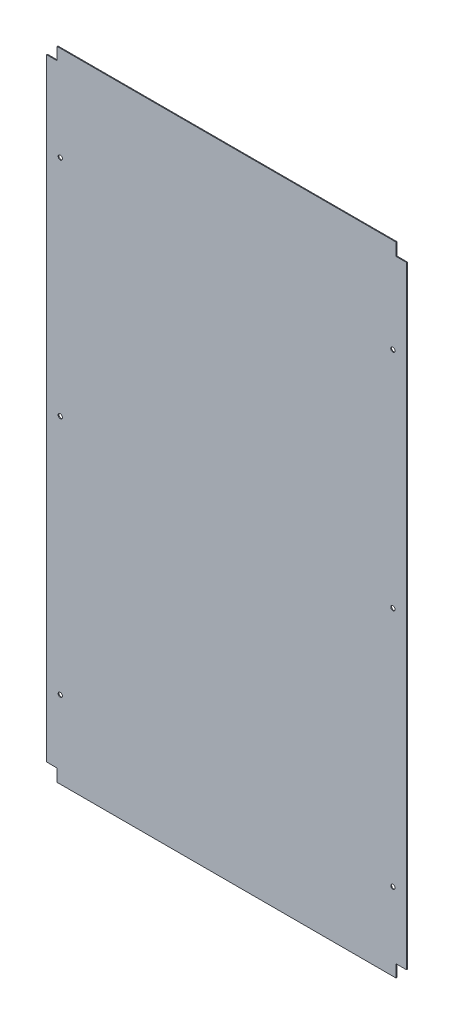
ISO-10303-21;
HEADER;
FILE_DESCRIPTION(('STEP AP214'),'2;1');
FILE_NAME('part.step','',(''),(''),'','','');
FILE_SCHEMA(('AUTOMOTIVE_DESIGN { 1 0 10303 214 1 1 1 1 }'));
ENDSEC;
DATA;
#1=APPLICATION_CONTEXT('core data for automotive mechanical design processes');
#2=APPLICATION_PROTOCOL_DEFINITION('international standard','automotive_design',2000,#1);
#3=PRODUCT_CONTEXT('',#1,'mechanical');
#4=PRODUCT('Part','Part','',(#3));
#5=PRODUCT_RELATED_PRODUCT_CATEGORY('part','',(#4));
#6=PRODUCT_DEFINITION_FORMATION('','',#4);
#7=PRODUCT_DEFINITION_CONTEXT('part definition',#1,'design');
#8=PRODUCT_DEFINITION('design','',#6,#7);
#9=PRODUCT_DEFINITION_SHAPE('','',#8);
#10=(LENGTH_UNIT() NAMED_UNIT(*) SI_UNIT(.MILLI.,.METRE.));
#11=(NAMED_UNIT(*) PLANE_ANGLE_UNIT() SI_UNIT($,.RADIAN.));
#12=(NAMED_UNIT(*) SI_UNIT($,.STERADIAN.) SOLID_ANGLE_UNIT());
#13=UNCERTAINTY_MEASURE_WITH_UNIT(LENGTH_MEASURE(1.E-05),#10,'distance_accuracy_value','');
#14=(GEOMETRIC_REPRESENTATION_CONTEXT(3) GLOBAL_UNCERTAINTY_ASSIGNED_CONTEXT((#13)) GLOBAL_UNIT_ASSIGNED_CONTEXT((#10,
#11,#12)) REPRESENTATION_CONTEXT('',''));
#15=CARTESIAN_POINT('',(0.,0.,0.));
#16=DIRECTION('',(0.,0.,1.));
#17=DIRECTION('',(1.,0.,0.));
#18=AXIS2_PLACEMENT_3D('',#15,#16,#17);
#19=CARTESIAN_POINT('',(0.,0.,-1.524));
#20=DIRECTION('',(0.,0.,1.));
#21=DIRECTION('',(1.,0.,0.));
#22=AXIS2_PLACEMENT_3D('',#19,#20,#21);
#23=PLANE('',#22);
#24=CARTESIAN_POINT('',(-306.451,-1.11022302462516E-13,-1.524));
#25=DIRECTION('',(0.,0.,1.));
#26=DIRECTION('',(1.,0.,0.));
#27=AXIS2_PLACEMENT_3D('',#24,#25,#26);
#28=CIRCLE('',#27,3.9624);
#29=CARTESIAN_POINT('',(-302.4886,-1.11022302462516E-13,-1.524));
#30=VERTEX_POINT('',#29);
#31=EDGE_CURVE('E420',#30,#30,#28,.T.);
#32=ORIENTED_EDGE('',*,*,#31,.T.);
#33=EDGE_LOOP('',(#32));
#34=FACE_BOUND('',#33,.T.);
#35=CARTESIAN_POINT('',(-306.451,412.75,-1.524));
#36=DIRECTION('',(0.,0.,1.));
#37=DIRECTION('',(1.,0.,0.));
#38=AXIS2_PLACEMENT_3D('',#35,#36,#37);
#39=CIRCLE('',#38,3.9624);
#40=CARTESIAN_POINT('',(-302.4886,412.75,-1.524));
#41=VERTEX_POINT('',#40);
#42=EDGE_CURVE('E416',#41,#41,#39,.T.);
#43=ORIENTED_EDGE('',*,*,#42,.T.);
#44=EDGE_LOOP('',(#43));
#45=FACE_BOUND('',#44,.T.);
#46=CARTESIAN_POINT('',(306.451,-444.5,-1.524));
#47=DIRECTION('',(0.,0.,1.));
#48=DIRECTION('',(1.,0.,0.));
#49=AXIS2_PLACEMENT_3D('',#46,#47,#48);
#50=CIRCLE('',#49,3.9624);
#51=CARTESIAN_POINT('',(310.4134,-444.5,-1.524));
#52=VERTEX_POINT('',#51);
#53=EDGE_CURVE('E412',#52,#52,#50,.T.);
#54=ORIENTED_EDGE('',*,*,#53,.T.);
#55=EDGE_LOOP('',(#54));
#56=FACE_BOUND('',#55,.T.);
#57=CARTESIAN_POINT('',(-306.451,-444.5,-1.524));
#58=DIRECTION('',(0.,0.,1.));
#59=DIRECTION('',(1.,0.,0.));
#60=AXIS2_PLACEMENT_3D('',#57,#58,#59);
#61=CIRCLE('',#60,3.9624);
#62=CARTESIAN_POINT('',(-302.4886,-444.5,-1.524));
#63=VERTEX_POINT('',#62);
#64=EDGE_CURVE('E408',#63,#63,#61,.T.);
#65=ORIENTED_EDGE('',*,*,#64,.T.);
#66=EDGE_LOOP('',(#65));
#67=FACE_BOUND('',#66,.T.);
#68=CARTESIAN_POINT('',(306.451,-1.11022302462516E-13,-1.524));
#69=DIRECTION('',(0.,0.,1.));
#70=DIRECTION('',(1.,0.,0.));
#71=AXIS2_PLACEMENT_3D('',#68,#69,#70);
#72=CIRCLE('',#71,3.9624);
#73=CARTESIAN_POINT('',(310.4134,-1.11022302462516E-13,-1.524));
#74=VERTEX_POINT('',#73);
#75=EDGE_CURVE('E404',#74,#74,#72,.T.);
#76=ORIENTED_EDGE('',*,*,#75,.T.);
#77=EDGE_LOOP('',(#76));
#78=FACE_BOUND('',#77,.T.);
#79=CARTESIAN_POINT('',(306.451,412.75,-1.524));
#80=DIRECTION('',(0.,0.,1.));
#81=DIRECTION('',(1.,0.,0.));
#82=AXIS2_PLACEMENT_3D('',#79,#80,#81);
#83=CIRCLE('',#82,3.9624);
#84=CARTESIAN_POINT('',(310.4134,412.75,-1.524));
#85=VERTEX_POINT('',#84);
#86=EDGE_CURVE('E400',#85,#85,#83,.T.);
#87=ORIENTED_EDGE('',*,*,#86,.T.);
#88=EDGE_LOOP('',(#87));
#89=FACE_BOUND('',#88,.T.);
#90=DIRECTION('',(0.,-1.,0.));
#91=VECTOR('',#90,1.);
#92=CARTESIAN_POINT('',(312.039,-568.506893218813,-1.52400000000003));
#93=LINE('',#92,#91);
#94=CARTESIAN_POINT('',(312.039,-587.234962531013,-1.52399999999975));
#95=VERTEX_POINT('',#94);
#96=CARTESIAN_POINT('',(312.039,-564.388,-1.52400000000003));
#97=VERTEX_POINT('',#96);
#98=EDGE_CURVE('E439',#95,#97,#93,.F.);
#99=ORIENTED_EDGE('',*,*,#98,.F.);
#100=DIRECTION('',(-1.,0.,0.));
#101=VECTOR('',#100,1.);
#102=CARTESIAN_POINT('',(0.,-587.234962531013,-1.52399999999975));
#103=LINE('',#102,#101);
#104=CARTESIAN_POINT('',(-312.039,-587.234962531013,-1.52399999999975));
#105=VERTEX_POINT('',#104);
#106=EDGE_CURVE('E363',#95,#105,#103,.T.);
#107=ORIENTED_EDGE('',*,*,#106,.T.);
#108=DIRECTION('',(0.,1.,0.));
#109=VECTOR('',#108,1.);
#110=CARTESIAN_POINT('',(-312.039,0.,-1.524));
#111=LINE('',#110,#109);
#112=CARTESIAN_POINT('',(-312.039,-564.388,-1.52400000000003));
#113=VERTEX_POINT('',#112);
#114=EDGE_CURVE('E396',#105,#113,#111,.T.);
#115=ORIENTED_EDGE('',*,*,#114,.T.);
#116=DIRECTION('',(-1.,0.,0.));
#117=VECTOR('',#116,1.);
#118=CARTESIAN_POINT('',(-313.810481265506,-564.388,-1.52400000000003));
#119=LINE('',#118,#117);
#120=CARTESIAN_POINT('',(-331.583962531012,-564.388,-1.52399999999986));
#121=VERTEX_POINT('',#120);
#122=EDGE_CURVE('E343',#113,#121,#119,.T.);
#123=ORIENTED_EDGE('',*,*,#122,.T.);
#124=DIRECTION('',(0.,1.,0.));
#125=VECTOR('',#124,1.);
#126=CARTESIAN_POINT('',(-331.583962531012,0.,-1.5239999999998));
#127=LINE('',#126,#125);
#128=CARTESIAN_POINT('',(-331.583962531012,564.388,-1.52399999999975));
#129=VERTEX_POINT('',#128);
#130=EDGE_CURVE('E336',#121,#129,#127,.T.);
#131=ORIENTED_EDGE('',*,*,#130,.T.);
#132=DIRECTION('',(-1.,0.,0.));
#133=VECTOR('',#132,1.);
#134=CARTESIAN_POINT('',(-313.810481265506,564.388,-1.52400000000003));
#135=LINE('',#134,#133);
#136=CARTESIAN_POINT('',(-312.039,564.388,-1.52400000000003));
#137=VERTEX_POINT('',#136);
#138=EDGE_CURVE('E346',#129,#137,#135,.F.);
#139=ORIENTED_EDGE('',*,*,#138,.T.);
#140=DIRECTION('',(0.,1.,0.));
#141=VECTOR('',#140,1.);
#142=CARTESIAN_POINT('',(-312.039,568.506893218813,-1.52400000000003));
#143=LINE('',#142,#141);
#144=CARTESIAN_POINT('',(-312.039,587.234962531012,-1.52399999999986));
#145=VERTEX_POINT('',#144);
#146=EDGE_CURVE('E424',#145,#137,#143,.F.);
#147=ORIENTED_EDGE('',*,*,#146,.F.);
#148=DIRECTION('',(-1.,0.,0.));
#149=VECTOR('',#148,1.);
#150=CARTESIAN_POINT('',(0.,587.234962531012,-1.52399999999986));
#151=LINE('',#150,#149);
#152=CARTESIAN_POINT('',(312.039,587.234962531012,-1.52399999999986));
#153=VERTEX_POINT('',#152);
#154=EDGE_CURVE('E296',#145,#153,#151,.F.);
#155=ORIENTED_EDGE('',*,*,#154,.T.);
#156=CARTESIAN_POINT('',(312.039,564.388,-1.52400000000003));
#157=VERTEX_POINT('',#156);
#158=EDGE_CURVE('E284',#157,#153,#93,.F.);
#159=ORIENTED_EDGE('',*,*,#158,.F.);
#160=DIRECTION('',(-1.,0.,0.));
#161=VECTOR('',#160,1.);
#162=CARTESIAN_POINT('',(313.810481265506,564.388,-1.52400000000003));
#163=LINE('',#162,#161);
#164=CARTESIAN_POINT('',(331.583962531012,564.388,-1.52399999999991));
#165=VERTEX_POINT('',#164);
#166=EDGE_CURVE('E316',#157,#165,#163,.F.);
#167=ORIENTED_EDGE('',*,*,#166,.T.);
#168=DIRECTION('',(0.,-1.,0.));
#169=VECTOR('',#168,1.);
#170=CARTESIAN_POINT('',(331.583962531012,0.,-1.52399999999991));
#171=LINE('',#170,#169);
#172=CARTESIAN_POINT('',(331.583962531012,-564.388,-1.52399999999991));
#173=VERTEX_POINT('',#172);
#174=EDGE_CURVE('E309',#165,#173,#171,.T.);
#175=ORIENTED_EDGE('',*,*,#174,.T.);
#176=DIRECTION('',(-1.,0.,0.));
#177=VECTOR('',#176,1.);
#178=CARTESIAN_POINT('',(313.810481265506,-564.388,-1.52400000000003));
#179=LINE('',#178,#177);
#180=EDGE_CURVE('E319',#173,#97,#179,.T.);
#181=ORIENTED_EDGE('',*,*,#180,.T.);
#182=EDGE_LOOP('',(#99,#107,#115,#123,#131,#139,#147,#155,#159,#167,#175,#181));
#183=FACE_BOUND('',#182,.T.);
#184=ADVANCED_FACE('F175',(#34,#45,#56,#67,#78,#89,#183),#23,.F.);
#185=CARTESIAN_POINT('',(0.,0.,0.));
#186=DIRECTION('',(0.,0.,1.));
#187=DIRECTION('',(1.,0.,0.));
#188=AXIS2_PLACEMENT_3D('',#185,#186,#187);
#189=PLANE('',#188);
#190=CARTESIAN_POINT('',(-306.451,-1.11022302462516E-13,0.));
#191=DIRECTION('',(0.,0.,1.));
#192=DIRECTION('',(1.,0.,0.));
#193=AXIS2_PLACEMENT_3D('',#190,#191,#192);
#194=CIRCLE('',#193,3.9624);
#195=CARTESIAN_POINT('',(-302.4886,-1.11022302462516E-13,0.));
#196=VERTEX_POINT('',#195);
#197=EDGE_CURVE('E277',#196,#196,#194,.T.);
#198=ORIENTED_EDGE('',*,*,#197,.F.);
#199=EDGE_LOOP('',(#198));
#200=FACE_BOUND('',#199,.T.);
#201=CARTESIAN_POINT('',(-306.451,412.75,0.));
#202=DIRECTION('',(0.,0.,1.));
#203=DIRECTION('',(1.,0.,0.));
#204=AXIS2_PLACEMENT_3D('',#201,#202,#203);
#205=CIRCLE('',#204,3.9624);
#206=CARTESIAN_POINT('',(-302.4886,412.75,0.));
#207=VERTEX_POINT('',#206);
#208=EDGE_CURVE('E385',#207,#207,#205,.T.);
#209=ORIENTED_EDGE('',*,*,#208,.F.);
#210=EDGE_LOOP('',(#209));
#211=FACE_BOUND('',#210,.T.);
#212=CARTESIAN_POINT('',(306.451,-444.5,0.));
#213=DIRECTION('',(0.,0.,1.));
#214=DIRECTION('',(1.,0.,0.));
#215=AXIS2_PLACEMENT_3D('',#212,#213,#214);
#216=CIRCLE('',#215,3.9624);
#217=CARTESIAN_POINT('',(310.4134,-444.5,0.));
#218=VERTEX_POINT('',#217);
#219=EDGE_CURVE('E381',#218,#218,#216,.T.);
#220=ORIENTED_EDGE('',*,*,#219,.F.);
#221=EDGE_LOOP('',(#220));
#222=FACE_BOUND('',#221,.T.);
#223=CARTESIAN_POINT('',(-306.451,-444.5,0.));
#224=DIRECTION('',(0.,0.,1.));
#225=DIRECTION('',(1.,0.,0.));
#226=AXIS2_PLACEMENT_3D('',#223,#224,#225);
#227=CIRCLE('',#226,3.9624);
#228=CARTESIAN_POINT('',(-302.4886,-444.5,0.));
#229=VERTEX_POINT('',#228);
#230=EDGE_CURVE('E377',#229,#229,#227,.T.);
#231=ORIENTED_EDGE('',*,*,#230,.F.);
#232=EDGE_LOOP('',(#231));
#233=FACE_BOUND('',#232,.T.);
#234=CARTESIAN_POINT('',(306.451,-1.11022302462516E-13,0.));
#235=DIRECTION('',(0.,0.,1.));
#236=DIRECTION('',(1.,0.,0.));
#237=AXIS2_PLACEMENT_3D('',#234,#235,#236);
#238=CIRCLE('',#237,3.9624);
#239=CARTESIAN_POINT('',(310.4134,-1.11022302462516E-13,0.));
#240=VERTEX_POINT('',#239);
#241=EDGE_CURVE('E375',#240,#240,#238,.T.);
#242=ORIENTED_EDGE('',*,*,#241,.F.);
#243=EDGE_LOOP('',(#242));
#244=FACE_BOUND('',#243,.T.);
#245=CARTESIAN_POINT('',(306.451,412.75,0.));
#246=DIRECTION('',(0.,0.,1.));
#247=DIRECTION('',(1.,0.,0.));
#248=AXIS2_PLACEMENT_3D('',#245,#246,#247);
#249=CIRCLE('',#248,3.9624);
#250=CARTESIAN_POINT('',(310.4134,412.75,0.));
#251=VERTEX_POINT('',#250);
#252=EDGE_CURVE('E389',#251,#251,#249,.T.);
#253=ORIENTED_EDGE('',*,*,#252,.F.);
#254=EDGE_LOOP('',(#253));
#255=FACE_BOUND('',#254,.T.);
#256=DIRECTION('',(0.,1.,0.));
#257=VECTOR('',#256,1.);
#258=CARTESIAN_POINT('',(-312.039,568.506893218813,0.));
#259=LINE('',#258,#257);
#260=CARTESIAN_POINT('',(-312.039,587.234962531012,0.));
#261=VERTEX_POINT('',#260);
#262=CARTESIAN_POINT('',(-312.039,564.388,0.));
#263=VERTEX_POINT('',#262);
#264=EDGE_CURVE('E435',#261,#263,#259,.F.);
#265=ORIENTED_EDGE('',*,*,#264,.T.);
#266=DIRECTION('',(-1.,0.,0.));
#267=VECTOR('',#266,1.);
#268=CARTESIAN_POINT('',(-313.810481265506,564.388,0.));
#269=LINE('',#268,#267);
#270=CARTESIAN_POINT('',(-331.583962531012,564.388,2.22044604925031E-13));
#271=VERTEX_POINT('',#270);
#272=EDGE_CURVE('E201',#271,#263,#269,.F.);
#273=ORIENTED_EDGE('',*,*,#272,.F.);
#274=DIRECTION('',(0.,-1.,0.));
#275=VECTOR('',#274,1.);
#276=CARTESIAN_POINT('',(-331.583962531012,-570.738,1.66533453693773E-13));
#277=LINE('',#276,#275);
#278=CARTESIAN_POINT('',(-331.583962531012,-564.388,2.22044604925031E-13));
#279=VERTEX_POINT('',#278);
#280=EDGE_CURVE('E323',#279,#271,#277,.F.);
#281=ORIENTED_EDGE('',*,*,#280,.F.);
#282=DIRECTION('',(-1.,0.,0.));
#283=VECTOR('',#282,1.);
#284=CARTESIAN_POINT('',(-313.810481265506,-564.388,0.));
#285=LINE('',#284,#283);
#286=CARTESIAN_POINT('',(-312.039,-564.388,0.));
#287=VERTEX_POINT('',#286);
#288=EDGE_CURVE('E331',#287,#279,#285,.T.);
#289=ORIENTED_EDGE('',*,*,#288,.F.);
#290=DIRECTION('',(0.,1.,0.));
#291=VECTOR('',#290,1.);
#292=CARTESIAN_POINT('',(-312.039,-564.388,0.));
#293=LINE('',#292,#291);
#294=CARTESIAN_POINT('',(-312.039,-587.234962531013,1.11022302462516E-13));
#295=VERTEX_POINT('',#294);
#296=EDGE_CURVE('E278',#295,#287,#293,.T.);
#297=ORIENTED_EDGE('',*,*,#296,.F.);
#298=DIRECTION('',(1.,0.,0.));
#299=VECTOR('',#298,1.);
#300=CARTESIAN_POINT('',(315.087,-587.234962531013,2.22044604925031E-13));
#301=LINE('',#300,#299);
#302=CARTESIAN_POINT('',(312.039,-587.234962531013,2.22044604925031E-13));
#303=VERTEX_POINT('',#302);
#304=EDGE_CURVE('E350',#303,#295,#301,.F.);
#305=ORIENTED_EDGE('',*,*,#304,.F.);
#306=DIRECTION('',(0.,-1.,0.));
#307=VECTOR('',#306,1.);
#308=CARTESIAN_POINT('',(312.039,-568.506893218813,0.));
#309=LINE('',#308,#307);
#310=CARTESIAN_POINT('',(312.039,-564.388,0.));
#311=VERTEX_POINT('',#310);
#312=EDGE_CURVE('E179',#303,#311,#309,.F.);
#313=ORIENTED_EDGE('',*,*,#312,.T.);
#314=DIRECTION('',(-1.,0.,0.));
#315=VECTOR('',#314,1.);
#316=CARTESIAN_POINT('',(313.810481265506,-564.388,0.));
#317=LINE('',#316,#315);
#318=CARTESIAN_POINT('',(331.583962531012,-564.388,1.11022302462516E-13));
#319=VERTEX_POINT('',#318);
#320=EDGE_CURVE('E193',#319,#311,#317,.T.);
#321=ORIENTED_EDGE('',*,*,#320,.F.);
#322=DIRECTION('',(0.,1.,0.));
#323=VECTOR('',#322,1.);
#324=CARTESIAN_POINT('',(331.583962531012,570.738,1.11022302462516E-13));
#325=LINE('',#324,#323);
#326=CARTESIAN_POINT('',(331.583962531012,564.388,1.11022302462516E-13));
#327=VERTEX_POINT('',#326);
#328=EDGE_CURVE('E289',#327,#319,#325,.F.);
#329=ORIENTED_EDGE('',*,*,#328,.F.);
#330=DIRECTION('',(-1.,0.,0.));
#331=VECTOR('',#330,1.);
#332=CARTESIAN_POINT('',(313.810481265506,564.388,0.));
#333=LINE('',#332,#331);
#334=CARTESIAN_POINT('',(312.039,564.388,0.));
#335=VERTEX_POINT('',#334);
#336=EDGE_CURVE('E273',#335,#327,#333,.F.);
#337=ORIENTED_EDGE('',*,*,#336,.F.);
#338=DIRECTION('',(0.,-1.,0.));
#339=VECTOR('',#338,1.);
#340=CARTESIAN_POINT('',(312.039,570.738,0.));
#341=LINE('',#340,#339);
#342=CARTESIAN_POINT('',(312.039,587.234962531012,0.));
#343=VERTEX_POINT('',#342);
#344=EDGE_CURVE('E268',#343,#335,#341,.T.);
#345=ORIENTED_EDGE('',*,*,#344,.F.);
#346=DIRECTION('',(1.,0.,0.));
#347=VECTOR('',#346,1.);
#348=CARTESIAN_POINT('',(315.087,587.234962531012,1.11022302462516E-13));
#349=LINE('',#348,#347);
#350=EDGE_CURVE('E271',#261,#343,#349,.T.);
#351=ORIENTED_EDGE('',*,*,#350,.F.);
#352=EDGE_LOOP('',(#265,#273,#281,#289,#297,#305,#313,#321,#329,#337,#345,#351));
#353=FACE_BOUND('',#352,.T.);
#354=ADVANCED_FACE('F177',(#200,#211,#222,#233,#244,#255,#353),#189,.T.);
#355=CARTESIAN_POINT('',(-312.039,-564.388,-131.572));
#356=DIRECTION('',(1.,0.,0.));
#357=DIRECTION('',(0.,0.,-1.));
#358=AXIS2_PLACEMENT_3D('',#355,#356,#357);
#359=PLANE('',#358);
#360=ORIENTED_EDGE('',*,*,#114,.F.);
#361=DIRECTION('',(0.,0.,1.));
#362=VECTOR('',#361,1.);
#363=CARTESIAN_POINT('',(-312.039,-587.234962531013,2.22044604925031E-13));
#364=LINE('',#363,#362);
#365=EDGE_CURVE('E355',#105,#295,#364,.T.);
#366=ORIENTED_EDGE('',*,*,#365,.T.);
#367=ORIENTED_EDGE('',*,*,#296,.T.);
#368=DIRECTION('',(0.,0.,1.));
#369=VECTOR('',#368,1.);
#370=CARTESIAN_POINT('',(-312.039,-564.388,-131.572));
#371=LINE('',#370,#369);
#372=EDGE_CURVE('E425',#113,#287,#371,.T.);
#373=ORIENTED_EDGE('',*,*,#372,.F.);
#374=EDGE_LOOP('',(#360,#366,#367,#373));
#375=FACE_BOUND('',#374,.T.);
#376=ADVANCED_FACE('F461',(#375),#359,.F.);
#377=CARTESIAN_POINT('',(312.039,-564.388,-131.572));
#378=DIRECTION('',(-1.,0.,0.));
#379=DIRECTION('',(0.,0.,1.));
#380=AXIS2_PLACEMENT_3D('',#377,#378,#379);
#381=PLANE('',#380);
#382=ORIENTED_EDGE('',*,*,#312,.F.);
#383=DIRECTION('',(0.,0.,-1.));
#384=VECTOR('',#383,1.);
#385=CARTESIAN_POINT('',(312.039,-587.234962531013,2.22044604925031E-13));
#386=LINE('',#385,#384);
#387=EDGE_CURVE('E359',#303,#95,#386,.T.);
#388=ORIENTED_EDGE('',*,*,#387,.T.);
#389=ORIENTED_EDGE('',*,*,#98,.T.);
#390=DIRECTION('',(0.,0.,1.));
#391=VECTOR('',#390,1.);
#392=CARTESIAN_POINT('',(312.039,-564.388,-131.572));
#393=LINE('',#392,#391);
#394=EDGE_CURVE('E13',#97,#311,#393,.T.);
#395=ORIENTED_EDGE('',*,*,#394,.T.);
#396=EDGE_LOOP('',(#382,#388,#389,#395));
#397=FACE_BOUND('',#396,.T.);
#398=ADVANCED_FACE('F467',(#397),#381,.F.);
#399=CARTESIAN_POINT('',(-312.039,570.738,-131.572));
#400=DIRECTION('',(1.,0.,0.));
#401=DIRECTION('',(0.,0.,-1.));
#402=AXIS2_PLACEMENT_3D('',#399,#400,#401);
#403=PLANE('',#402);
#404=ORIENTED_EDGE('',*,*,#264,.F.);
#405=DIRECTION('',(0.,0.,-1.));
#406=VECTOR('',#405,1.);
#407=CARTESIAN_POINT('',(-312.039,587.234962531012,1.11022302462516E-13));
#408=LINE('',#407,#406);
#409=EDGE_CURVE('E290',#261,#145,#408,.T.);
#410=ORIENTED_EDGE('',*,*,#409,.T.);
#411=ORIENTED_EDGE('',*,*,#146,.T.);
#412=DIRECTION('',(0.,0.,1.));
#413=VECTOR('',#412,1.);
#414=CARTESIAN_POINT('',(-312.039,564.388,-131.572));
#415=LINE('',#414,#413);
#416=EDGE_CURVE('E428',#137,#263,#415,.T.);
#417=ORIENTED_EDGE('',*,*,#416,.T.);
#418=EDGE_LOOP('',(#404,#410,#411,#417));
#419=FACE_BOUND('',#418,.T.);
#420=ADVANCED_FACE('F447',(#419),#403,.F.);
#421=CARTESIAN_POINT('',(312.039,570.738,-131.572));
#422=DIRECTION('',(-1.,0.,0.));
#423=DIRECTION('',(0.,0.,1.));
#424=AXIS2_PLACEMENT_3D('',#421,#422,#423);
#425=PLANE('',#424);
#426=ORIENTED_EDGE('',*,*,#158,.T.);
#427=DIRECTION('',(0.,0.,1.));
#428=VECTOR('',#427,1.);
#429=CARTESIAN_POINT('',(312.039,587.234962531012,1.11022302462516E-13));
#430=LINE('',#429,#428);
#431=EDGE_CURVE('E281',#153,#343,#430,.T.);
#432=ORIENTED_EDGE('',*,*,#431,.T.);
#433=ORIENTED_EDGE('',*,*,#344,.T.);
#434=DIRECTION('',(0.,0.,1.));
#435=VECTOR('',#434,1.);
#436=CARTESIAN_POINT('',(312.039,564.388,-131.572));
#437=LINE('',#436,#435);
#438=EDGE_CURVE('E185',#157,#335,#437,.T.);
#439=ORIENTED_EDGE('',*,*,#438,.F.);
#440=EDGE_LOOP('',(#426,#432,#433,#439));
#441=FACE_BOUND('',#440,.T.);
#442=ADVANCED_FACE('F282',(#441),#425,.F.);
#443=CARTESIAN_POINT('',(306.451,412.75,-131.572));
#444=DIRECTION('',(0.,0.,1.));
#445=DIRECTION('',(1.,0.,0.));
#446=AXIS2_PLACEMENT_3D('',#443,#444,#445);
#447=CYLINDRICAL_SURFACE('',#446,3.9624);
#448=ORIENTED_EDGE('',*,*,#252,.T.);
#449=EDGE_LOOP('',(#448));
#450=FACE_BOUND('',#449,.T.);
#451=ORIENTED_EDGE('',*,*,#86,.F.);
#452=EDGE_LOOP('',(#451));
#453=FACE_BOUND('',#452,.T.);
#454=ADVANCED_FACE('F495',(#450,#453),#447,.F.);
#455=CARTESIAN_POINT('',(306.451,-1.11022302462516E-13,-131.572));
#456=DIRECTION('',(0.,0.,1.));
#457=DIRECTION('',(1.,0.,0.));
#458=AXIS2_PLACEMENT_3D('',#455,#456,#457);
#459=CYLINDRICAL_SURFACE('',#458,3.9624);
#460=ORIENTED_EDGE('',*,*,#241,.T.);
#461=EDGE_LOOP('',(#460));
#462=FACE_BOUND('',#461,.T.);
#463=ORIENTED_EDGE('',*,*,#75,.F.);
#464=EDGE_LOOP('',(#463));
#465=FACE_BOUND('',#464,.T.);
#466=ADVANCED_FACE('F506',(#462,#465),#459,.F.);
#467=CARTESIAN_POINT('',(-306.451,-444.5,-131.572));
#468=DIRECTION('',(0.,0.,1.));
#469=DIRECTION('',(1.,0.,0.));
#470=AXIS2_PLACEMENT_3D('',#467,#468,#469);
#471=CYLINDRICAL_SURFACE('',#470,3.9624);
#472=ORIENTED_EDGE('',*,*,#230,.T.);
#473=EDGE_LOOP('',(#472));
#474=FACE_BOUND('',#473,.T.);
#475=ORIENTED_EDGE('',*,*,#64,.F.);
#476=EDGE_LOOP('',(#475));
#477=FACE_BOUND('',#476,.T.);
#478=ADVANCED_FACE('F511',(#474,#477),#471,.F.);
#479=CARTESIAN_POINT('',(306.451,-444.5,-131.572));
#480=DIRECTION('',(0.,0.,1.));
#481=DIRECTION('',(1.,0.,0.));
#482=AXIS2_PLACEMENT_3D('',#479,#480,#481);
#483=CYLINDRICAL_SURFACE('',#482,3.9624);
#484=ORIENTED_EDGE('',*,*,#219,.T.);
#485=EDGE_LOOP('',(#484));
#486=FACE_BOUND('',#485,.T.);
#487=ORIENTED_EDGE('',*,*,#53,.F.);
#488=EDGE_LOOP('',(#487));
#489=FACE_BOUND('',#488,.T.);
#490=ADVANCED_FACE('F522',(#486,#489),#483,.F.);
#491=CARTESIAN_POINT('',(-306.451,412.75,-131.572));
#492=DIRECTION('',(0.,0.,1.));
#493=DIRECTION('',(1.,0.,0.));
#494=AXIS2_PLACEMENT_3D('',#491,#492,#493);
#495=CYLINDRICAL_SURFACE('',#494,3.9624);
#496=ORIENTED_EDGE('',*,*,#208,.T.);
#497=EDGE_LOOP('',(#496));
#498=FACE_BOUND('',#497,.T.);
#499=ORIENTED_EDGE('',*,*,#42,.F.);
#500=EDGE_LOOP('',(#499));
#501=FACE_BOUND('',#500,.T.);
#502=ADVANCED_FACE('F528',(#498,#501),#495,.F.);
#503=CARTESIAN_POINT('',(-306.451,-1.11022302462516E-13,-131.572));
#504=DIRECTION('',(0.,0.,1.));
#505=DIRECTION('',(1.,0.,0.));
#506=AXIS2_PLACEMENT_3D('',#503,#504,#505);
#507=CYLINDRICAL_SURFACE('',#506,3.9624);
#508=ORIENTED_EDGE('',*,*,#197,.T.);
#509=EDGE_LOOP('',(#508));
#510=FACE_BOUND('',#509,.T.);
#511=ORIENTED_EDGE('',*,*,#31,.F.);
#512=EDGE_LOOP('',(#511));
#513=FACE_BOUND('',#512,.T.);
#514=ADVANCED_FACE('F530',(#510,#513),#507,.F.);
#515=CARTESIAN_POINT('',(315.087,-587.234962531013,2.22044604925031E-13));
#516=DIRECTION('',(0.,-1.,0.));
#517=DIRECTION('',(0.,0.,-1.));
#518=AXIS2_PLACEMENT_3D('',#515,#516,#517);
#519=PLANE('',#518);
#520=ORIENTED_EDGE('',*,*,#387,.F.);
#521=ORIENTED_EDGE('',*,*,#304,.T.);
#522=ORIENTED_EDGE('',*,*,#365,.F.);
#523=ORIENTED_EDGE('',*,*,#106,.F.);
#524=EDGE_LOOP('',(#520,#521,#522,#523));
#525=FACE_BOUND('',#524,.T.);
#526=ADVANCED_FACE('F466',(#525),#519,.T.);
#527=CARTESIAN_POINT('',(-313.810481265506,-564.388,-0.792480000000035));
#528=DIRECTION('',(0.,-1.,0.));
#529=DIRECTION('',(-1.,0.,0.));
#530=AXIS2_PLACEMENT_3D('',#527,#528,#529);
#531=PLANE('',#530);
#532=ORIENTED_EDGE('',*,*,#372,.T.);
#533=ORIENTED_EDGE('',*,*,#288,.T.);
#534=DIRECTION('',(0.,0.,-1.));
#535=VECTOR('',#534,1.);
#536=CARTESIAN_POINT('',(-331.583962531012,-564.388,1.11022302462516E-13));
#537=LINE('',#536,#535);
#538=EDGE_CURVE('E332',#279,#121,#537,.T.);
#539=ORIENTED_EDGE('',*,*,#538,.T.);
#540=ORIENTED_EDGE('',*,*,#122,.F.);
#541=EDGE_LOOP('',(#532,#533,#539,#540));
#542=FACE_BOUND('',#541,.T.);
#543=ADVANCED_FACE('F571',(#542),#531,.T.);
#544=CARTESIAN_POINT('',(-313.810481265506,564.388,-0.792480000000035));
#545=DIRECTION('',(0.,-1.,0.));
#546=DIRECTION('',(-1.,0.,0.));
#547=AXIS2_PLACEMENT_3D('',#544,#545,#546);
#548=PLANE('',#547);
#549=ORIENTED_EDGE('',*,*,#272,.T.);
#550=ORIENTED_EDGE('',*,*,#416,.F.);
#551=ORIENTED_EDGE('',*,*,#138,.F.);
#552=DIRECTION('',(0.,0.,1.));
#553=VECTOR('',#552,1.);
#554=CARTESIAN_POINT('',(-331.583962531012,564.388,1.11022302462516E-13));
#555=LINE('',#554,#553);
#556=EDGE_CURVE('E328',#129,#271,#555,.T.);
#557=ORIENTED_EDGE('',*,*,#556,.T.);
#558=EDGE_LOOP('',(#549,#550,#551,#557));
#559=FACE_BOUND('',#558,.T.);
#560=ADVANCED_FACE('F451',(#559),#548,.F.);
#561=CARTESIAN_POINT('',(-331.583962531012,-570.738,1.11022302462516E-13));
#562=DIRECTION('',(-1.,0.,0.));
#563=DIRECTION('',(0.,0.,1.));
#564=AXIS2_PLACEMENT_3D('',#561,#562,#563);
#565=PLANE('',#564);
#566=ORIENTED_EDGE('',*,*,#556,.F.);
#567=ORIENTED_EDGE('',*,*,#130,.F.);
#568=ORIENTED_EDGE('',*,*,#538,.F.);
#569=ORIENTED_EDGE('',*,*,#280,.T.);
#570=EDGE_LOOP('',(#566,#567,#568,#569));
#571=FACE_BOUND('',#570,.T.);
#572=ADVANCED_FACE('F453',(#571),#565,.T.);
#573=CARTESIAN_POINT('',(313.810481265506,564.388,-0.79248000000003));
#574=DIRECTION('',(0.,-1.,0.));
#575=DIRECTION('',(-1.,0.,0.));
#576=AXIS2_PLACEMENT_3D('',#573,#574,#575);
#577=PLANE('',#576);
#578=ORIENTED_EDGE('',*,*,#438,.T.);
#579=ORIENTED_EDGE('',*,*,#336,.T.);
#580=DIRECTION('',(0.,0.,-1.));
#581=VECTOR('',#580,1.);
#582=CARTESIAN_POINT('',(331.583962531012,564.388,1.11022302462516E-13));
#583=LINE('',#582,#581);
#584=EDGE_CURVE('E305',#327,#165,#583,.T.);
#585=ORIENTED_EDGE('',*,*,#584,.T.);
#586=ORIENTED_EDGE('',*,*,#166,.F.);
#587=EDGE_LOOP('',(#578,#579,#585,#586));
#588=FACE_BOUND('',#587,.T.);
#589=ADVANCED_FACE('F475',(#588),#577,.F.);
#590=CARTESIAN_POINT('',(313.810481265506,-564.388,-0.79248000000003));
#591=DIRECTION('',(0.,-1.,0.));
#592=DIRECTION('',(-1.,0.,0.));
#593=AXIS2_PLACEMENT_3D('',#590,#591,#592);
#594=PLANE('',#593);
#595=ORIENTED_EDGE('',*,*,#320,.T.);
#596=ORIENTED_EDGE('',*,*,#394,.F.);
#597=ORIENTED_EDGE('',*,*,#180,.F.);
#598=DIRECTION('',(0.,0.,1.));
#599=VECTOR('',#598,1.);
#600=CARTESIAN_POINT('',(331.583962531012,-564.388,1.11022302462516E-13));
#601=LINE('',#600,#599);
#602=EDGE_CURVE('E302',#173,#319,#601,.T.);
#603=ORIENTED_EDGE('',*,*,#602,.T.);
#604=EDGE_LOOP('',(#595,#596,#597,#603));
#605=FACE_BOUND('',#604,.T.);
#606=ADVANCED_FACE('F468',(#605),#594,.T.);
#607=CARTESIAN_POINT('',(331.583962531012,570.738,1.11022302462516E-13));
#608=DIRECTION('',(1.,0.,0.));
#609=DIRECTION('',(0.,0.,-1.));
#610=AXIS2_PLACEMENT_3D('',#607,#608,#609);
#611=PLANE('',#610);
#612=ORIENTED_EDGE('',*,*,#584,.F.);
#613=ORIENTED_EDGE('',*,*,#328,.T.);
#614=ORIENTED_EDGE('',*,*,#602,.F.);
#615=ORIENTED_EDGE('',*,*,#174,.F.);
#616=EDGE_LOOP('',(#612,#613,#614,#615));
#617=FACE_BOUND('',#616,.T.);
#618=ADVANCED_FACE('F473',(#617),#611,.T.);
#619=CARTESIAN_POINT('',(315.087,587.234962531012,1.11022302462516E-13));
#620=DIRECTION('',(0.,1.,0.));
#621=DIRECTION('',(0.,0.,1.));
#622=AXIS2_PLACEMENT_3D('',#619,#620,#621);
#623=PLANE('',#622);
#624=ORIENTED_EDGE('',*,*,#431,.F.);
#625=ORIENTED_EDGE('',*,*,#154,.F.);
#626=ORIENTED_EDGE('',*,*,#409,.F.);
#627=ORIENTED_EDGE('',*,*,#350,.T.);
#628=EDGE_LOOP('',(#624,#625,#626,#627));
#629=FACE_BOUND('',#628,.T.);
#630=ADVANCED_FACE('F293',(#629),#623,.T.);
#631=CLOSED_SHELL('',(#184,#354,#376,#398,#420,#442,#454,#466,#478,#490,#502,#514,#526,#543,
#560,#572,#589,#606,#618,#630));
#632=MANIFOLD_SOLID_BREP('B2',#631);
#633=ADVANCED_BREP_SHAPE_REPRESENTATION('',(#18,#632),#14);
#634=SHAPE_DEFINITION_REPRESENTATION(#9,#633);
ENDSEC;
END-ISO-10303-21;
